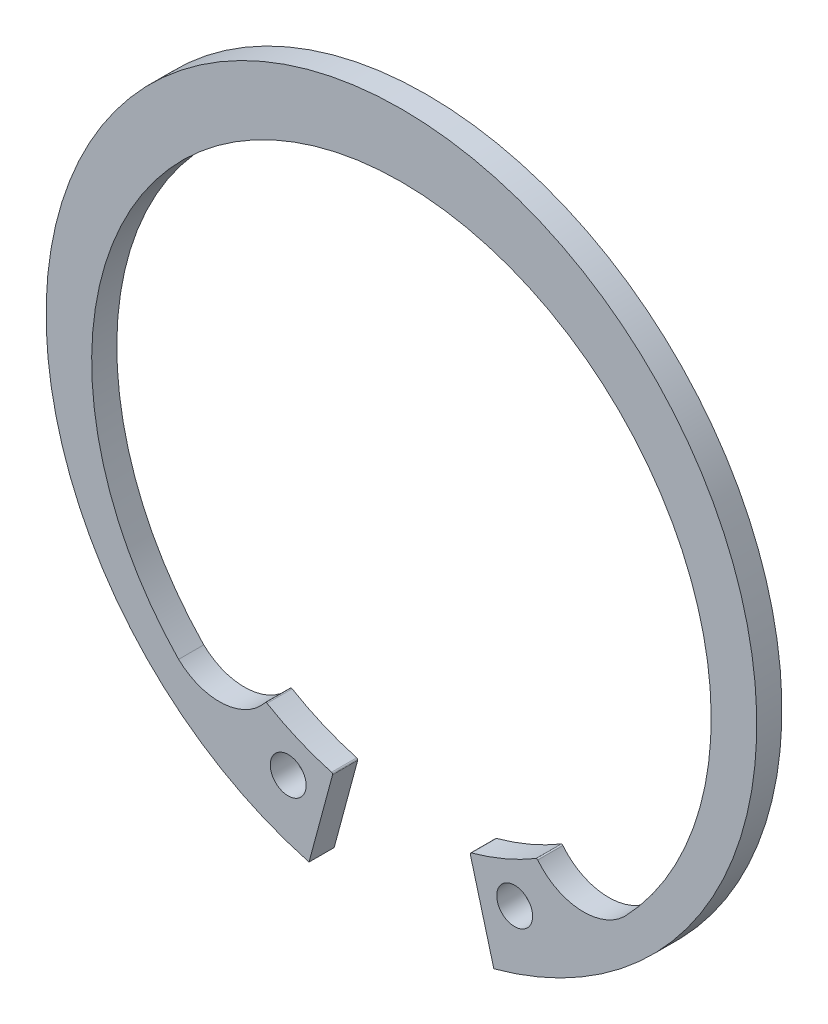
ISO-10303-21;
HEADER;
FILE_DESCRIPTION(('STEP AP214'),'2;1');
FILE_NAME('part.step','',(''),(''),'','','');
FILE_SCHEMA(('AUTOMOTIVE_DESIGN { 1 0 10303 214 1 1 1 1 }'));
ENDSEC;
DATA;
#1=APPLICATION_CONTEXT('core data for automotive mechanical design processes');
#2=APPLICATION_PROTOCOL_DEFINITION('international standard','automotive_design',2000,#1);
#3=PRODUCT_CONTEXT('',#1,'mechanical');
#4=PRODUCT('Part','Part','',(#3));
#5=PRODUCT_RELATED_PRODUCT_CATEGORY('part','',(#4));
#6=PRODUCT_DEFINITION_FORMATION('','',#4);
#7=PRODUCT_DEFINITION_CONTEXT('part definition',#1,'design');
#8=PRODUCT_DEFINITION('design','',#6,#7);
#9=PRODUCT_DEFINITION_SHAPE('','',#8);
#10=(LENGTH_UNIT() NAMED_UNIT(*) SI_UNIT(.MILLI.,.METRE.));
#11=(NAMED_UNIT(*) PLANE_ANGLE_UNIT() SI_UNIT($,.RADIAN.));
#12=(NAMED_UNIT(*) SI_UNIT($,.STERADIAN.) SOLID_ANGLE_UNIT());
#13=UNCERTAINTY_MEASURE_WITH_UNIT(LENGTH_MEASURE(1.E-05),#10,'distance_accuracy_value','');
#14=(GEOMETRIC_REPRESENTATION_CONTEXT(3) GLOBAL_UNCERTAINTY_ASSIGNED_CONTEXT((#13)) GLOBAL_UNIT_ASSIGNED_CONTEXT((#10,
#11,#12)) REPRESENTATION_CONTEXT('',''));
#15=CARTESIAN_POINT('',(0.,0.,0.));
#16=DIRECTION('',(0.,0.,1.));
#17=DIRECTION('',(1.,0.,0.));
#18=AXIS2_PLACEMENT_3D('',#15,#16,#17);
#19=CARTESIAN_POINT('',(0.,0.,-1.75));
#20=DIRECTION('',(0.,0.,1.));
#21=DIRECTION('',(1.,0.,0.));
#22=AXIS2_PLACEMENT_3D('',#19,#20,#21);
#23=CYLINDRICAL_SURFACE('',#22,24.75);
#24=CARTESIAN_POINT('',(0.,0.,-1.75));
#25=DIRECTION('',(0.,0.,1.));
#26=DIRECTION('',(1.,0.,0.));
#27=AXIS2_PLACEMENT_3D('',#24,#25,#26);
#28=CIRCLE('',#27,24.75);
#29=CARTESIAN_POINT('',(6.4361116524491,-23.8985139035298,-1.75));
#30=VERTEX_POINT('',#29);
#31=CARTESIAN_POINT('',(-6.4361116524491,-23.8985139035298,-1.75));
#32=VERTEX_POINT('',#31);
#33=EDGE_CURVE('E147',#30,#32,#28,.T.);
#34=ORIENTED_EDGE('',*,*,#33,.T.);
#35=DIRECTION('',(0.,0.,1.));
#36=VECTOR('',#35,1.);
#37=CARTESIAN_POINT('',(-6.4361116524491,-23.8985139035298,-1.75));
#38=LINE('',#37,#36);
#39=CARTESIAN_POINT('',(-6.4361116524491,-23.8985139035298,0.));
#40=VERTEX_POINT('',#39);
#41=EDGE_CURVE('E37',#32,#40,#38,.T.);
#42=ORIENTED_EDGE('',*,*,#41,.T.);
#43=CARTESIAN_POINT('',(0.,0.,0.));
#44=DIRECTION('',(0.,0.,1.));
#45=DIRECTION('',(1.,0.,0.));
#46=AXIS2_PLACEMENT_3D('',#43,#44,#45);
#47=CIRCLE('',#46,24.75);
#48=CARTESIAN_POINT('',(6.4361116524491,-23.8985139035298,0.));
#49=VERTEX_POINT('',#48);
#50=EDGE_CURVE('E58',#49,#40,#47,.T.);
#51=ORIENTED_EDGE('',*,*,#50,.F.);
#52=DIRECTION('',(0.,0.,1.));
#53=VECTOR('',#52,1.);
#54=CARTESIAN_POINT('',(6.4361116524491,-23.8985139035298,-1.75));
#55=LINE('',#54,#53);
#56=EDGE_CURVE('E11',#30,#49,#55,.T.);
#57=ORIENTED_EDGE('',*,*,#56,.F.);
#58=EDGE_LOOP('',(#34,#42,#51,#57));
#59=FACE_BOUND('',#58,.T.);
#60=ADVANCED_FACE('F34',(#59),#23,.T.);
#61=CARTESIAN_POINT('',(6.4361116524491,-23.8985139035298,-1.75));
#62=DIRECTION('',(-0.965596521354741,-0.260044915250468,0.));
#63=DIRECTION('',(0.260044915250468,-0.965596521354741,0.));
#64=AXIS2_PLACEMENT_3D('',#61,#62,#63);
#65=PLANE('',#64);
#66=DIRECTION('',(0.260044915250468,-0.965596521354741,0.));
#67=VECTOR('',#66,1.);
#68=CARTESIAN_POINT('',(6.4361116524491,-23.8985139035298,0.));
#69=LINE('',#68,#67);
#70=CARTESIAN_POINT('',(4.79775821297681,-17.814994137799,0.));
#71=VERTEX_POINT('',#70);
#72=EDGE_CURVE('E250',#71,#49,#69,.T.);
#73=ORIENTED_EDGE('',*,*,#72,.F.);
#74=DIRECTION('',(0.,0.,1.));
#75=VECTOR('',#74,1.);
#76=CARTESIAN_POINT('',(4.79775821297681,-17.814994137799,-1.75));
#77=LINE('',#76,#75);
#78=CARTESIAN_POINT('',(4.79775821297681,-17.814994137799,-1.75));
#79=VERTEX_POINT('',#78);
#80=EDGE_CURVE('E223',#79,#71,#77,.T.);
#81=ORIENTED_EDGE('',*,*,#80,.F.);
#82=DIRECTION('',(0.260044915250468,-0.965596521354741,0.));
#83=VECTOR('',#82,1.);
#84=CARTESIAN_POINT('',(6.4361116524491,-23.8985139035298,-1.75));
#85=LINE('',#84,#83);
#86=EDGE_CURVE('E253',#79,#30,#85,.T.);
#87=ORIENTED_EDGE('',*,*,#86,.T.);
#88=ORIENTED_EDGE('',*,*,#56,.T.);
#89=EDGE_LOOP('',(#73,#81,#87,#88));
#90=FACE_BOUND('',#89,.T.);
#91=ADVANCED_FACE('F266',(#90),#65,.T.);
#92=CARTESIAN_POINT('',(0.,-1.22542652111631,-1.75));
#93=DIRECTION('',(0.,0.,1.));
#94=DIRECTION('',(1.,0.,0.));
#95=AXIS2_PLACEMENT_3D('',#92,#93,#94);
#96=CYLINDRICAL_SURFACE('',#95,21.5754265211163);
#97=DIRECTION('',(0.,0.,1.));
#98=VECTOR('',#97,1.);
#99=CARTESIAN_POINT('',(-15.5200012228605,-16.213041128201,-1.75));
#100=LINE('',#99,#98);
#101=CARTESIAN_POINT('',(-15.5200012228605,-16.213041128201,-1.75));
#102=VERTEX_POINT('',#101);
#103=CARTESIAN_POINT('',(-15.5200012228605,-16.213041128201,0.));
#104=VERTEX_POINT('',#103);
#105=EDGE_CURVE('E188',#102,#104,#100,.T.);
#106=ORIENTED_EDGE('',*,*,#105,.F.);
#107=CARTESIAN_POINT('',(0.,-1.22542652111631,-1.75));
#108=DIRECTION('',(0.,0.,-1.));
#109=DIRECTION('',(1.,0.,0.));
#110=AXIS2_PLACEMENT_3D('',#107,#108,#109);
#111=CIRCLE('',#110,21.5754265211163);
#112=CARTESIAN_POINT('',(15.5200012228605,-16.213041128201,-1.75));
#113=VERTEX_POINT('',#112);
#114=EDGE_CURVE('E66',#102,#113,#111,.T.);
#115=ORIENTED_EDGE('',*,*,#114,.T.);
#116=DIRECTION('',(0.,0.,1.));
#117=VECTOR('',#116,1.);
#118=CARTESIAN_POINT('',(15.5200012228605,-16.213041128201,-1.75));
#119=LINE('',#118,#117);
#120=CARTESIAN_POINT('',(15.5200012228605,-16.213041128201,0.));
#121=VERTEX_POINT('',#120);
#122=EDGE_CURVE('E226',#121,#113,#119,.F.);
#123=ORIENTED_EDGE('',*,*,#122,.F.);
#124=CARTESIAN_POINT('',(0.,-1.22542652111631,0.));
#125=DIRECTION('',(0.,0.,-1.));
#126=DIRECTION('',(1.,0.,0.));
#127=AXIS2_PLACEMENT_3D('',#124,#125,#126);
#128=CIRCLE('',#127,21.5754265211163);
#129=EDGE_CURVE('E259',#104,#121,#128,.T.);
#130=ORIENTED_EDGE('',*,*,#129,.F.);
#131=EDGE_LOOP('',(#106,#115,#123,#130));
#132=FACE_BOUND('',#131,.T.);
#133=ADVANCED_FACE('F288',(#132),#96,.F.);
#134=CARTESIAN_POINT('',(-6.4361116524491,-23.8985139035298,-1.75));
#135=DIRECTION('',(0.965596521354741,-0.260044915250469,0.));
#136=DIRECTION('',(0.260044915250469,0.965596521354741,0.));
#137=AXIS2_PLACEMENT_3D('',#134,#135,#136);
#138=PLANE('',#137);
#139=DIRECTION('',(0.260044915250469,0.965596521354741,0.));
#140=VECTOR('',#139,1.);
#141=CARTESIAN_POINT('',(-6.4361116524491,-23.8985139035298,0.));
#142=LINE('',#141,#140);
#143=CARTESIAN_POINT('',(-4.79775821297681,-17.814994137799,0.));
#144=VERTEX_POINT('',#143);
#145=EDGE_CURVE('E257',#40,#144,#142,.T.);
#146=ORIENTED_EDGE('',*,*,#145,.F.);
#147=ORIENTED_EDGE('',*,*,#41,.F.);
#148=DIRECTION('',(0.260044915250469,0.965596521354741,0.));
#149=VECTOR('',#148,1.);
#150=CARTESIAN_POINT('',(-6.4361116524491,-23.8985139035298,-1.75));
#151=LINE('',#150,#149);
#152=CARTESIAN_POINT('',(-4.79775821297681,-17.814994137799,-1.75));
#153=VERTEX_POINT('',#152);
#154=EDGE_CURVE('E139',#32,#153,#151,.T.);
#155=ORIENTED_EDGE('',*,*,#154,.T.);
#156=DIRECTION('',(0.,0.,1.));
#157=VECTOR('',#156,1.);
#158=CARTESIAN_POINT('',(-4.79775821297681,-17.814994137799,-1.75));
#159=LINE('',#158,#157);
#160=EDGE_CURVE('E143',#153,#144,#159,.T.);
#161=ORIENTED_EDGE('',*,*,#160,.T.);
#162=EDGE_LOOP('',(#146,#147,#155,#161));
#163=FACE_BOUND('',#162,.T.);
#164=ADVANCED_FACE('F142',(#163),#138,.T.);
#165=CARTESIAN_POINT('',(0.,0.,-1.75));
#166=DIRECTION('',(0.,0.,1.));
#167=DIRECTION('',(1.,0.,0.));
#168=AXIS2_PLACEMENT_3D('',#165,#166,#167);
#169=PLANE('',#168);
#170=ORIENTED_EDGE('',*,*,#114,.F.);
#171=DIRECTION('',(-0.691498892900989,-0.722377519802981,0.));
#172=VECTOR('',#171,1.);
#173=CARTESIAN_POINT('',(-17.1145975992995,-17.8788436151238,-1.75));
#174=LINE('',#173,#172);
#175=CARTESIAN_POINT('',(-15.51730565808,-16.2102251939738,-1.75));
#176=VERTEX_POINT('',#175);
#177=EDGE_CURVE('E157',#176,#102,#174,.T.);
#178=ORIENTED_EDGE('',*,*,#177,.F.);
#179=CARTESIAN_POINT('',(-12.6890046847332,-13.2556274883847,-1.75));
#180=DIRECTION('',(0.,0.,-1.));
#181=DIRECTION('',(1.,0.,0.));
#182=AXIS2_PLACEMENT_3D('',#179,#180,#181);
#183=CIRCLE('',#182,4.09010195443912);
#184=CARTESIAN_POINT('',(-9.49123336413031,-15.8057632845408,-1.75));
#185=VERTEX_POINT('',#184);
#186=EDGE_CURVE('E174',#185,#176,#183,.T.);
#187=ORIENTED_EDGE('',*,*,#186,.F.);
#188=CARTESIAN_POINT('',(-9.41305019519653,-15.868112238786,-1.75));
#189=DIRECTION('',(0.,0.,1.));
#190=DIRECTION('',(1.,0.,0.));
#191=AXIS2_PLACEMENT_3D('',#188,#189,#190);
#192=CIRCLE('',#191,0.099999999999998);
#193=CARTESIAN_POINT('',(-9.36203095294615,-15.7821062103915,-1.75));
#194=VERTEX_POINT('',#193);
#195=EDGE_CURVE('E166',#194,#185,#192,.T.);
#196=ORIENTED_EDGE('',*,*,#195,.F.);
#197=CARTESIAN_POINT('',(0.,0.,-1.75));
#198=DIRECTION('',(0.,0.,-1.));
#199=DIRECTION('',(1.,0.,0.));
#200=AXIS2_PLACEMENT_3D('',#197,#198,#199);
#201=CIRCLE('',#200,18.35);
#202=CARTESIAN_POINT('',(-4.86779039700869,-17.6925723582183,-1.75));
#203=VERTEX_POINT('',#202);
#204=EDGE_CURVE('E162',#203,#194,#201,.T.);
#205=ORIENTED_EDGE('',*,*,#204,.F.);
#206=CARTESIAN_POINT('',(-4.89431786511228,-17.788989646274,-1.75));
#207=DIRECTION('',(0.,0.,1.));
#208=DIRECTION('',(-1.,0.,0.));
#209=AXIS2_PLACEMENT_3D('',#206,#207,#208);
#210=CIRCLE('',#209,0.0999999999999985);
#211=EDGE_CURVE('E153',#153,#203,#210,.T.);
#212=ORIENTED_EDGE('',*,*,#211,.F.);
#213=ORIENTED_EDGE('',*,*,#154,.F.);
#214=ORIENTED_EDGE('',*,*,#33,.F.);
#215=ORIENTED_EDGE('',*,*,#86,.F.);
#216=CARTESIAN_POINT('',(4.89431786511229,-17.788989646274,-1.75));
#217=DIRECTION('',(0.,0.,1.));
#218=DIRECTION('',(1.,0.,0.));
#219=AXIS2_PLACEMENT_3D('',#216,#217,#218);
#220=CIRCLE('',#219,0.100000000000001);
#221=CARTESIAN_POINT('',(4.8677903970087,-17.6925723582183,-1.75));
#222=VERTEX_POINT('',#221);
#223=EDGE_CURVE('E208',#222,#79,#220,.T.);
#224=ORIENTED_EDGE('',*,*,#223,.F.);
#225=CARTESIAN_POINT('',(0.,0.,-1.75));
#226=DIRECTION('',(0.,0.,-1.));
#227=DIRECTION('',(1.,0.,0.));
#228=AXIS2_PLACEMENT_3D('',#225,#226,#227);
#229=CIRCLE('',#228,18.35);
#230=CARTESIAN_POINT('',(9.36203095294614,-15.7821062103915,-1.75));
#231=VERTEX_POINT('',#230);
#232=EDGE_CURVE('E206',#231,#222,#229,.T.);
#233=ORIENTED_EDGE('',*,*,#232,.F.);
#234=CARTESIAN_POINT('',(9.41305019519653,-15.868112238786,-1.75));
#235=DIRECTION('',(0.,0.,1.));
#236=DIRECTION('',(-1.,0.,0.));
#237=AXIS2_PLACEMENT_3D('',#234,#235,#236);
#238=CIRCLE('',#237,0.099999999999998);
#239=CARTESIAN_POINT('',(9.49123336413031,-15.8057632845408,-1.75));
#240=VERTEX_POINT('',#239);
#241=EDGE_CURVE('E203',#240,#231,#238,.T.);
#242=ORIENTED_EDGE('',*,*,#241,.F.);
#243=CARTESIAN_POINT('',(12.6890046847332,-13.2556274883847,-1.75));
#244=DIRECTION('',(0.,0.,-1.));
#245=DIRECTION('',(1.,0.,0.));
#246=AXIS2_PLACEMENT_3D('',#243,#244,#245);
#247=CIRCLE('',#246,4.09010195443912);
#248=CARTESIAN_POINT('',(15.51730565808,-16.2102251939738,-1.75));
#249=VERTEX_POINT('',#248);
#250=EDGE_CURVE('E199',#249,#240,#247,.T.);
#251=ORIENTED_EDGE('',*,*,#250,.F.);
#252=DIRECTION('',(-0.691498892900989,0.722377519802981,0.));
#253=VECTOR('',#252,1.);
#254=CARTESIAN_POINT('',(15.51730565808,-16.2102251939738,-1.75));
#255=LINE('',#254,#253);
#256=EDGE_CURVE('E197',#113,#249,#255,.T.);
#257=ORIENTED_EDGE('',*,*,#256,.F.);
#258=EDGE_LOOP('',(#170,#178,#187,#196,#205,#212,#213,#214,#215,#224,#233,#242,#251,#257));
#259=FACE_BOUND('',#258,.T.);
#260=CARTESIAN_POINT('',(7.88649275770018,-19.3819208795914,-1.75));
#261=DIRECTION('',(0.,0.,1.));
#262=DIRECTION('',(1.,0.,0.));
#263=AXIS2_PLACEMENT_3D('',#260,#261,#262);
#264=CIRCLE('',#263,1.25);
#265=CARTESIAN_POINT('',(9.13649275770018,-19.3819208795914,-1.75));
#266=VERTEX_POINT('',#265);
#267=EDGE_CURVE('E245',#266,#266,#264,.T.);
#268=ORIENTED_EDGE('',*,*,#267,.T.);
#269=EDGE_LOOP('',(#268));
#270=FACE_BOUND('',#269,.T.);
#271=CARTESIAN_POINT('',(-7.88649275770018,-19.3819208795914,-1.75));
#272=DIRECTION('',(0.,0.,1.));
#273=DIRECTION('',(1.,0.,0.));
#274=AXIS2_PLACEMENT_3D('',#271,#272,#273);
#275=CIRCLE('',#274,1.25);
#276=CARTESIAN_POINT('',(-6.63649275770018,-19.3819208795914,-1.75));
#277=VERTEX_POINT('',#276);
#278=EDGE_CURVE('E239',#277,#277,#275,.T.);
#279=ORIENTED_EDGE('',*,*,#278,.T.);
#280=EDGE_LOOP('',(#279));
#281=FACE_BOUND('',#280,.T.);
#282=ADVANCED_FACE('F159',(#259,#270,#281),#169,.F.);
#283=CARTESIAN_POINT('',(0.,0.,0.));
#284=DIRECTION('',(0.,0.,1.));
#285=DIRECTION('',(1.,0.,0.));
#286=AXIS2_PLACEMENT_3D('',#283,#284,#285);
#287=PLANE('',#286);
#288=DIRECTION('',(-0.691498892900989,-0.722377519802981,0.));
#289=VECTOR('',#288,1.);
#290=CARTESIAN_POINT('',(-17.1145975992995,-17.8788436151238,0.));
#291=LINE('',#290,#289);
#292=CARTESIAN_POINT('',(-15.51730565808,-16.2102251939738,0.));
#293=VERTEX_POINT('',#292);
#294=EDGE_CURVE('E164',#293,#104,#291,.T.);
#295=ORIENTED_EDGE('',*,*,#294,.T.);
#296=ORIENTED_EDGE('',*,*,#129,.T.);
#297=DIRECTION('',(-0.691498892900989,0.722377519802981,0.));
#298=VECTOR('',#297,1.);
#299=CARTESIAN_POINT('',(15.51730565808,-16.2102251939738,0.));
#300=LINE('',#299,#298);
#301=CARTESIAN_POINT('',(15.51730565808,-16.2102251939738,0.));
#302=VERTEX_POINT('',#301);
#303=EDGE_CURVE('E196',#121,#302,#300,.T.);
#304=ORIENTED_EDGE('',*,*,#303,.T.);
#305=CARTESIAN_POINT('',(12.6890046847332,-13.2556274883847,0.));
#306=DIRECTION('',(0.,0.,-1.));
#307=DIRECTION('',(1.,0.,0.));
#308=AXIS2_PLACEMENT_3D('',#305,#306,#307);
#309=CIRCLE('',#308,4.09010195443912);
#310=CARTESIAN_POINT('',(9.49123336413031,-15.8057632845408,0.));
#311=VERTEX_POINT('',#310);
#312=EDGE_CURVE('E213',#302,#311,#309,.T.);
#313=ORIENTED_EDGE('',*,*,#312,.T.);
#314=CARTESIAN_POINT('',(9.41305019519653,-15.868112238786,0.));
#315=DIRECTION('',(0.,0.,1.));
#316=DIRECTION('',(-1.,0.,0.));
#317=AXIS2_PLACEMENT_3D('',#314,#315,#316);
#318=CIRCLE('',#317,0.099999999999998);
#319=CARTESIAN_POINT('',(9.36203095294614,-15.7821062103915,0.));
#320=VERTEX_POINT('',#319);
#321=EDGE_CURVE('E216',#311,#320,#318,.T.);
#322=ORIENTED_EDGE('',*,*,#321,.T.);
#323=CARTESIAN_POINT('',(0.,0.,0.));
#324=DIRECTION('',(0.,0.,-1.));
#325=DIRECTION('',(1.,0.,0.));
#326=AXIS2_PLACEMENT_3D('',#323,#324,#325);
#327=CIRCLE('',#326,18.35);
#328=CARTESIAN_POINT('',(4.8677903970087,-17.6925723582183,0.));
#329=VERTEX_POINT('',#328);
#330=EDGE_CURVE('E219',#320,#329,#327,.T.);
#331=ORIENTED_EDGE('',*,*,#330,.T.);
#332=CARTESIAN_POINT('',(4.89431786511229,-17.788989646274,0.));
#333=DIRECTION('',(0.,0.,1.));
#334=DIRECTION('',(1.,0.,0.));
#335=AXIS2_PLACEMENT_3D('',#332,#333,#334);
#336=CIRCLE('',#335,0.100000000000001);
#337=EDGE_CURVE('E200',#329,#71,#336,.T.);
#338=ORIENTED_EDGE('',*,*,#337,.T.);
#339=ORIENTED_EDGE('',*,*,#72,.T.);
#340=ORIENTED_EDGE('',*,*,#50,.T.);
#341=ORIENTED_EDGE('',*,*,#145,.T.);
#342=CARTESIAN_POINT('',(-4.89431786511228,-17.788989646274,0.));
#343=DIRECTION('',(0.,0.,1.));
#344=DIRECTION('',(-1.,0.,0.));
#345=AXIS2_PLACEMENT_3D('',#342,#343,#344);
#346=CIRCLE('',#345,0.0999999999999985);
#347=CARTESIAN_POINT('',(-4.86779039700869,-17.6925723582183,0.));
#348=VERTEX_POINT('',#347);
#349=EDGE_CURVE('E155',#144,#348,#346,.T.);
#350=ORIENTED_EDGE('',*,*,#349,.T.);
#351=CARTESIAN_POINT('',(0.,0.,0.));
#352=DIRECTION('',(0.,0.,-1.));
#353=DIRECTION('',(1.,0.,0.));
#354=AXIS2_PLACEMENT_3D('',#351,#352,#353);
#355=CIRCLE('',#354,18.35);
#356=CARTESIAN_POINT('',(-9.36203095294615,-15.7821062103915,0.));
#357=VERTEX_POINT('',#356);
#358=EDGE_CURVE('E179',#348,#357,#355,.T.);
#359=ORIENTED_EDGE('',*,*,#358,.T.);
#360=CARTESIAN_POINT('',(-9.41305019519653,-15.868112238786,0.));
#361=DIRECTION('',(0.,0.,1.));
#362=DIRECTION('',(1.,0.,0.));
#363=AXIS2_PLACEMENT_3D('',#360,#361,#362);
#364=CIRCLE('',#363,0.099999999999998);
#365=CARTESIAN_POINT('',(-9.49123336413031,-15.8057632845408,0.));
#366=VERTEX_POINT('',#365);
#367=EDGE_CURVE('E181',#357,#366,#364,.T.);
#368=ORIENTED_EDGE('',*,*,#367,.T.);
#369=CARTESIAN_POINT('',(-12.6890046847332,-13.2556274883847,0.));
#370=DIRECTION('',(0.,0.,-1.));
#371=DIRECTION('',(1.,0.,0.));
#372=AXIS2_PLACEMENT_3D('',#369,#370,#371);
#373=CIRCLE('',#372,4.09010195443912);
#374=EDGE_CURVE('E169',#366,#293,#373,.T.);
#375=ORIENTED_EDGE('',*,*,#374,.T.);
#376=EDGE_LOOP('',(#295,#296,#304,#313,#322,#331,#338,#339,#340,#341,#350,#359,#368,#375));
#377=FACE_BOUND('',#376,.T.);
#378=CARTESIAN_POINT('',(7.88649275770018,-19.3819208795914,0.));
#379=DIRECTION('',(0.,0.,1.));
#380=DIRECTION('',(1.,0.,0.));
#381=AXIS2_PLACEMENT_3D('',#378,#379,#380);
#382=CIRCLE('',#381,1.25);
#383=CARTESIAN_POINT('',(9.13649275770018,-19.3819208795914,0.));
#384=VERTEX_POINT('',#383);
#385=EDGE_CURVE('E242',#384,#384,#382,.T.);
#386=ORIENTED_EDGE('',*,*,#385,.F.);
#387=EDGE_LOOP('',(#386));
#388=FACE_BOUND('',#387,.T.);
#389=CARTESIAN_POINT('',(-7.88649275770018,-19.3819208795914,0.));
#390=DIRECTION('',(0.,0.,1.));
#391=DIRECTION('',(1.,0.,0.));
#392=AXIS2_PLACEMENT_3D('',#389,#390,#391);
#393=CIRCLE('',#392,1.25);
#394=CARTESIAN_POINT('',(-6.63649275770018,-19.3819208795914,0.));
#395=VERTEX_POINT('',#394);
#396=EDGE_CURVE('E238',#395,#395,#393,.T.);
#397=ORIENTED_EDGE('',*,*,#396,.F.);
#398=EDGE_LOOP('',(#397));
#399=FACE_BOUND('',#398,.T.);
#400=ADVANCED_FACE('F261',(#377,#388,#399),#287,.T.);
#401=CARTESIAN_POINT('',(7.88649275770018,-19.3819208795914,-1.75));
#402=DIRECTION('',(0.,0.,1.));
#403=DIRECTION('',(1.,0.,0.));
#404=AXIS2_PLACEMENT_3D('',#401,#402,#403);
#405=CYLINDRICAL_SURFACE('',#404,1.25);
#406=ORIENTED_EDGE('',*,*,#267,.F.);
#407=EDGE_LOOP('',(#406));
#408=FACE_BOUND('',#407,.T.);
#409=ORIENTED_EDGE('',*,*,#385,.T.);
#410=EDGE_LOOP('',(#409));
#411=FACE_BOUND('',#410,.T.);
#412=ADVANCED_FACE('F311',(#408,#411),#405,.F.);
#413=CARTESIAN_POINT('',(-7.88649275770018,-19.3819208795914,-1.75));
#414=DIRECTION('',(0.,0.,1.));
#415=DIRECTION('',(1.,0.,0.));
#416=AXIS2_PLACEMENT_3D('',#413,#414,#415);
#417=CYLINDRICAL_SURFACE('',#416,1.25);
#418=ORIENTED_EDGE('',*,*,#278,.F.);
#419=EDGE_LOOP('',(#418));
#420=FACE_BOUND('',#419,.T.);
#421=ORIENTED_EDGE('',*,*,#396,.T.);
#422=EDGE_LOOP('',(#421));
#423=FACE_BOUND('',#422,.T.);
#424=ADVANCED_FACE('F304',(#420,#423),#417,.F.);
#425=CARTESIAN_POINT('',(0.,0.,-1.75));
#426=DIRECTION('',(0.,0.,1.));
#427=DIRECTION('',(1.,0.,0.));
#428=AXIS2_PLACEMENT_3D('',#425,#426,#427);
#429=CYLINDRICAL_SURFACE('',#428,18.35);
#430=ORIENTED_EDGE('',*,*,#330,.F.);
#431=DIRECTION('',(0.,0.,1.));
#432=VECTOR('',#431,1.);
#433=CARTESIAN_POINT('',(9.36203095294614,-15.7821062103915,-1.75));
#434=LINE('',#433,#432);
#435=EDGE_CURVE('E230',#231,#320,#434,.T.);
#436=ORIENTED_EDGE('',*,*,#435,.F.);
#437=ORIENTED_EDGE('',*,*,#232,.T.);
#438=DIRECTION('',(0.,0.,1.));
#439=VECTOR('',#438,1.);
#440=CARTESIAN_POINT('',(4.8677903970087,-17.6925723582183,-1.75));
#441=LINE('',#440,#439);
#442=EDGE_CURVE('E227',#222,#329,#441,.T.);
#443=ORIENTED_EDGE('',*,*,#442,.T.);
#444=EDGE_LOOP('',(#430,#436,#437,#443));
#445=FACE_BOUND('',#444,.T.);
#446=ADVANCED_FACE('F302',(#445),#429,.F.);
#447=CARTESIAN_POINT('',(4.89431786511229,-17.788989646274,-1.75));
#448=DIRECTION('',(0.,0.,1.));
#449=DIRECTION('',(1.,0.,0.));
#450=AXIS2_PLACEMENT_3D('',#447,#448,#449);
#451=CYLINDRICAL_SURFACE('',#450,0.100000000000001);
#452=ORIENTED_EDGE('',*,*,#337,.F.);
#453=ORIENTED_EDGE('',*,*,#442,.F.);
#454=ORIENTED_EDGE('',*,*,#223,.T.);
#455=ORIENTED_EDGE('',*,*,#80,.T.);
#456=EDGE_LOOP('',(#452,#453,#454,#455));
#457=FACE_BOUND('',#456,.T.);
#458=ADVANCED_FACE('F268',(#457),#451,.T.);
#459=CARTESIAN_POINT('',(9.41305019519653,-15.868112238786,-1.75));
#460=DIRECTION('',(0.,0.,1.));
#461=DIRECTION('',(1.,0.,0.));
#462=AXIS2_PLACEMENT_3D('',#459,#460,#461);
#463=CYLINDRICAL_SURFACE('',#462,0.099999999999998);
#464=ORIENTED_EDGE('',*,*,#321,.F.);
#465=DIRECTION('',(0.,0.,1.));
#466=VECTOR('',#465,1.);
#467=CARTESIAN_POINT('',(9.49123336413031,-15.8057632845408,-1.75));
#468=LINE('',#467,#466);
#469=EDGE_CURVE('E233',#240,#311,#468,.T.);
#470=ORIENTED_EDGE('',*,*,#469,.F.);
#471=ORIENTED_EDGE('',*,*,#241,.T.);
#472=ORIENTED_EDGE('',*,*,#435,.T.);
#473=EDGE_LOOP('',(#464,#470,#471,#472));
#474=FACE_BOUND('',#473,.T.);
#475=ADVANCED_FACE('F300',(#474),#463,.T.);
#476=CARTESIAN_POINT('',(12.6890046847332,-13.2556274883847,-1.75));
#477=DIRECTION('',(0.,0.,1.));
#478=DIRECTION('',(1.,0.,0.));
#479=AXIS2_PLACEMENT_3D('',#476,#477,#478);
#480=CYLINDRICAL_SURFACE('',#479,4.09010195443912);
#481=ORIENTED_EDGE('',*,*,#312,.F.);
#482=DIRECTION('',(0.,0.,1.));
#483=VECTOR('',#482,1.);
#484=CARTESIAN_POINT('',(15.51730565808,-16.2102251939738,-1.75));
#485=LINE('',#484,#483);
#486=EDGE_CURVE('E211',#249,#302,#485,.T.);
#487=ORIENTED_EDGE('',*,*,#486,.F.);
#488=ORIENTED_EDGE('',*,*,#250,.T.);
#489=ORIENTED_EDGE('',*,*,#469,.T.);
#490=EDGE_LOOP('',(#481,#487,#488,#489));
#491=FACE_BOUND('',#490,.T.);
#492=ADVANCED_FACE('F297',(#491),#480,.F.);
#493=CARTESIAN_POINT('',(15.51730565808,-16.2102251939738,-1.75));
#494=DIRECTION('',(0.722377519802981,0.69149889290099,0.));
#495=DIRECTION('',(-0.69149889290099,0.722377519802981,0.));
#496=AXIS2_PLACEMENT_3D('',#493,#494,#495);
#497=PLANE('',#496);
#498=ORIENTED_EDGE('',*,*,#303,.F.);
#499=ORIENTED_EDGE('',*,*,#122,.T.);
#500=ORIENTED_EDGE('',*,*,#256,.T.);
#501=ORIENTED_EDGE('',*,*,#486,.T.);
#502=EDGE_LOOP('',(#498,#499,#500,#501));
#503=FACE_BOUND('',#502,.T.);
#504=ADVANCED_FACE('F294',(#503),#497,.T.);
#505=CARTESIAN_POINT('',(0.,0.,-1.75));
#506=DIRECTION('',(0.,0.,1.));
#507=DIRECTION('',(1.,0.,0.));
#508=AXIS2_PLACEMENT_3D('',#505,#506,#507);
#509=CYLINDRICAL_SURFACE('',#508,18.35);
#510=ORIENTED_EDGE('',*,*,#358,.F.);
#511=DIRECTION('',(0.,0.,1.));
#512=VECTOR('',#511,1.);
#513=CARTESIAN_POINT('',(-4.86779039700869,-17.6925723582183,-1.75));
#514=LINE('',#513,#512);
#515=EDGE_CURVE('E156',#203,#348,#514,.T.);
#516=ORIENTED_EDGE('',*,*,#515,.F.);
#517=ORIENTED_EDGE('',*,*,#204,.T.);
#518=DIRECTION('',(0.,0.,1.));
#519=VECTOR('',#518,1.);
#520=CARTESIAN_POINT('',(-9.36203095294615,-15.7821062103915,-1.75));
#521=LINE('',#520,#519);
#522=EDGE_CURVE('E191',#194,#357,#521,.T.);
#523=ORIENTED_EDGE('',*,*,#522,.T.);
#524=EDGE_LOOP('',(#510,#516,#517,#523));
#525=FACE_BOUND('',#524,.T.);
#526=ADVANCED_FACE('F276',(#525),#509,.F.);
#527=CARTESIAN_POINT('',(-17.1145975992995,-17.8788436151238,-1.75));
#528=DIRECTION('',(-0.722377519802981,0.69149889290099,0.));
#529=DIRECTION('',(-0.69149889290099,-0.722377519802981,0.));
#530=AXIS2_PLACEMENT_3D('',#527,#528,#529);
#531=PLANE('',#530);
#532=ORIENTED_EDGE('',*,*,#177,.T.);
#533=ORIENTED_EDGE('',*,*,#105,.T.);
#534=ORIENTED_EDGE('',*,*,#294,.F.);
#535=DIRECTION('',(0.,0.,1.));
#536=VECTOR('',#535,1.);
#537=CARTESIAN_POINT('',(-15.51730565808,-16.2102251939738,-1.75));
#538=LINE('',#537,#536);
#539=EDGE_CURVE('E186',#176,#293,#538,.T.);
#540=ORIENTED_EDGE('',*,*,#539,.F.);
#541=EDGE_LOOP('',(#532,#533,#534,#540));
#542=FACE_BOUND('',#541,.T.);
#543=ADVANCED_FACE('F286',(#542),#531,.T.);
#544=CARTESIAN_POINT('',(-12.6890046847332,-13.2556274883847,-1.75));
#545=DIRECTION('',(0.,0.,1.));
#546=DIRECTION('',(1.,0.,0.));
#547=AXIS2_PLACEMENT_3D('',#544,#545,#546);
#548=CYLINDRICAL_SURFACE('',#547,4.09010195443912);
#549=ORIENTED_EDGE('',*,*,#374,.F.);
#550=DIRECTION('',(0.,0.,1.));
#551=VECTOR('',#550,1.);
#552=CARTESIAN_POINT('',(-9.49123336413031,-15.8057632845408,-1.75));
#553=LINE('',#552,#551);
#554=EDGE_CURVE('E189',#185,#366,#553,.T.);
#555=ORIENTED_EDGE('',*,*,#554,.F.);
#556=ORIENTED_EDGE('',*,*,#186,.T.);
#557=ORIENTED_EDGE('',*,*,#539,.T.);
#558=EDGE_LOOP('',(#549,#555,#556,#557));
#559=FACE_BOUND('',#558,.T.);
#560=ADVANCED_FACE('F282',(#559),#548,.F.);
#561=CARTESIAN_POINT('',(-9.41305019519653,-15.868112238786,-1.75));
#562=DIRECTION('',(0.,0.,1.));
#563=DIRECTION('',(1.,0.,0.));
#564=AXIS2_PLACEMENT_3D('',#561,#562,#563);
#565=CYLINDRICAL_SURFACE('',#564,0.099999999999998);
#566=ORIENTED_EDGE('',*,*,#367,.F.);
#567=ORIENTED_EDGE('',*,*,#522,.F.);
#568=ORIENTED_EDGE('',*,*,#195,.T.);
#569=ORIENTED_EDGE('',*,*,#554,.T.);
#570=EDGE_LOOP('',(#566,#567,#568,#569));
#571=FACE_BOUND('',#570,.T.);
#572=ADVANCED_FACE('F278',(#571),#565,.T.);
#573=CARTESIAN_POINT('',(-4.89431786511228,-17.788989646274,-1.75));
#574=DIRECTION('',(0.,0.,1.));
#575=DIRECTION('',(1.,0.,0.));
#576=AXIS2_PLACEMENT_3D('',#573,#574,#575);
#577=CYLINDRICAL_SURFACE('',#576,0.0999999999999985);
#578=ORIENTED_EDGE('',*,*,#349,.F.);
#579=ORIENTED_EDGE('',*,*,#160,.F.);
#580=ORIENTED_EDGE('',*,*,#211,.T.);
#581=ORIENTED_EDGE('',*,*,#515,.T.);
#582=EDGE_LOOP('',(#578,#579,#580,#581));
#583=FACE_BOUND('',#582,.T.);
#584=ADVANCED_FACE('F151',(#583),#577,.T.);
#585=CLOSED_SHELL('',(#60,#91,#133,#164,#282,#400,#412,#424,#446,#458,#475,#492,#504,#526,#543,
#560,#572,#584));
#586=MANIFOLD_SOLID_BREP('B2',#585);
#587=ADVANCED_BREP_SHAPE_REPRESENTATION('',(#18,#586),#14);
#588=SHAPE_DEFINITION_REPRESENTATION(#9,#587);
ENDSEC;
END-ISO-10303-21;
